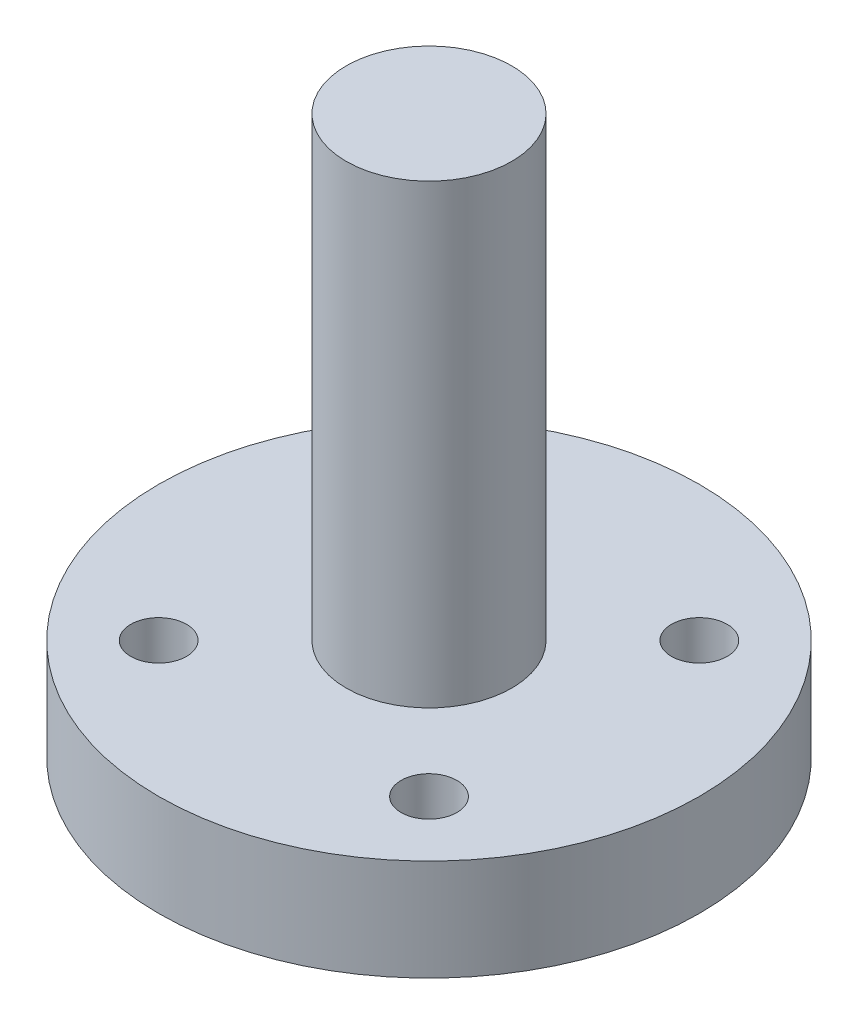
ISO-10303-21;
HEADER;
FILE_DESCRIPTION(('STEP AP214'),'2;1');
FILE_NAME('part.step','',(''),(''),'','','');
FILE_SCHEMA(('AUTOMOTIVE_DESIGN { 1 0 10303 214 1 1 1 1 }'));
ENDSEC;
DATA;
#1=APPLICATION_CONTEXT('core data for automotive mechanical design processes');
#2=APPLICATION_PROTOCOL_DEFINITION('international standard','automotive_design',2000,#1);
#3=PRODUCT_CONTEXT('',#1,'mechanical');
#4=PRODUCT('Part','Part','',(#3));
#5=PRODUCT_RELATED_PRODUCT_CATEGORY('part','',(#4));
#6=PRODUCT_DEFINITION_FORMATION('','',#4);
#7=PRODUCT_DEFINITION_CONTEXT('part definition',#1,'design');
#8=PRODUCT_DEFINITION('design','',#6,#7);
#9=PRODUCT_DEFINITION_SHAPE('','',#8);
#10=(LENGTH_UNIT() NAMED_UNIT(*) SI_UNIT(.MILLI.,.METRE.));
#11=(NAMED_UNIT(*) PLANE_ANGLE_UNIT() SI_UNIT($,.RADIAN.));
#12=(NAMED_UNIT(*) SI_UNIT($,.STERADIAN.) SOLID_ANGLE_UNIT());
#13=UNCERTAINTY_MEASURE_WITH_UNIT(LENGTH_MEASURE(1.E-05),#10,'distance_accuracy_value','');
#14=(GEOMETRIC_REPRESENTATION_CONTEXT(3) GLOBAL_UNCERTAINTY_ASSIGNED_CONTEXT((#13)) GLOBAL_UNIT_ASSIGNED_CONTEXT((#10,
#11,#12)) REPRESENTATION_CONTEXT('',''));
#15=CARTESIAN_POINT('',(0.,0.,0.));
#16=DIRECTION('',(0.,0.,1.));
#17=DIRECTION('',(1.,0.,0.));
#18=AXIS2_PLACEMENT_3D('',#15,#16,#17);
#19=CARTESIAN_POINT('',(0.,6.,0.));
#20=DIRECTION('',(0.,-1.,0.));
#21=DIRECTION('',(0.,0.,-1.));
#22=AXIS2_PLACEMENT_3D('',#19,#20,#21);
#23=CYLINDRICAL_SURFACE('',#22,16.);
#24=CARTESIAN_POINT('',(0.,6.,0.));
#25=DIRECTION('',(0.,1.,0.));
#26=DIRECTION('',(0.,0.,1.));
#27=AXIS2_PLACEMENT_3D('',#24,#25,#26);
#28=CIRCLE('',#27,16.);
#29=CARTESIAN_POINT('',(0.,6.,16.));
#30=VERTEX_POINT('',#29);
#31=EDGE_CURVE('E42',#30,#30,#28,.T.);
#32=ORIENTED_EDGE('',*,*,#31,.F.);
#33=EDGE_LOOP('',(#32));
#34=FACE_BOUND('',#33,.T.);
#35=CARTESIAN_POINT('',(0.,0.,0.));
#36=DIRECTION('',(0.,1.,0.));
#37=DIRECTION('',(0.,0.,1.));
#38=AXIS2_PLACEMENT_3D('',#35,#36,#37);
#39=CIRCLE('',#38,16.);
#40=CARTESIAN_POINT('',(0.,0.,16.));
#41=VERTEX_POINT('',#40);
#42=EDGE_CURVE('E38',#41,#41,#39,.T.);
#43=ORIENTED_EDGE('',*,*,#42,.T.);
#44=EDGE_LOOP('',(#43));
#45=FACE_BOUND('',#44,.T.);
#46=ADVANCED_FACE('F35',(#34,#45),#23,.T.);
#47=CARTESIAN_POINT('',(0.,6.,0.));
#48=DIRECTION('',(0.,1.,0.));
#49=DIRECTION('',(0.,0.,1.));
#50=AXIS2_PLACEMENT_3D('',#47,#48,#49);
#51=PLANE('',#50);
#52=CARTESIAN_POINT('',(0.,6.,0.));
#53=DIRECTION('',(0.,1.,0.));
#54=DIRECTION('',(0.,0.,1.));
#55=AXIS2_PLACEMENT_3D('',#52,#53,#54);
#56=CIRCLE('',#55,4.9);
#57=CARTESIAN_POINT('',(0.,6.,4.9));
#58=VERTEX_POINT('',#57);
#59=EDGE_CURVE('E10',#58,#58,#56,.T.);
#60=ORIENTED_EDGE('',*,*,#59,.F.);
#61=EDGE_LOOP('',(#60));
#62=FACE_BOUND('',#61,.T.);
#63=CARTESIAN_POINT('',(8.,6.,-8.));
#64=DIRECTION('',(0.,-1.,0.));
#65=DIRECTION('',(0.,0.,-1.));
#66=AXIS2_PLACEMENT_3D('',#63,#64,#65);
#67=CIRCLE('',#66,1.65);
#68=CARTESIAN_POINT('',(8.,6.,-9.65));
#69=VERTEX_POINT('',#68);
#70=EDGE_CURVE('E53',#69,#69,#67,.T.);
#71=ORIENTED_EDGE('',*,*,#70,.T.);
#72=EDGE_LOOP('',(#71));
#73=FACE_BOUND('',#72,.T.);
#74=CARTESIAN_POINT('',(7.99999999999999,6.,8.));
#75=DIRECTION('',(0.,-1.,0.));
#76=DIRECTION('',(0.,0.,-1.));
#77=AXIS2_PLACEMENT_3D('',#74,#75,#76);
#78=CIRCLE('',#77,1.65);
#79=CARTESIAN_POINT('',(7.99999999999999,6.,6.35));
#80=VERTEX_POINT('',#79);
#81=EDGE_CURVE('E59',#80,#80,#78,.T.);
#82=ORIENTED_EDGE('',*,*,#81,.T.);
#83=EDGE_LOOP('',(#82));
#84=FACE_BOUND('',#83,.T.);
#85=CARTESIAN_POINT('',(-8.,6.,8.));
#86=DIRECTION('',(0.,-1.,0.));
#87=DIRECTION('',(0.,0.,-1.));
#88=AXIS2_PLACEMENT_3D('',#85,#86,#87);
#89=CIRCLE('',#88,1.65);
#90=CARTESIAN_POINT('',(-8.,6.,6.35));
#91=VERTEX_POINT('',#90);
#92=EDGE_CURVE('E65',#91,#91,#89,.T.);
#93=ORIENTED_EDGE('',*,*,#92,.T.);
#94=EDGE_LOOP('',(#93));
#95=FACE_BOUND('',#94,.T.);
#96=CARTESIAN_POINT('',(-8.,6.,-8.));
#97=DIRECTION('',(0.,-1.,0.));
#98=DIRECTION('',(0.,0.,-1.));
#99=AXIS2_PLACEMENT_3D('',#96,#97,#98);
#100=CIRCLE('',#99,1.65);
#101=CARTESIAN_POINT('',(-8.,6.,-9.65));
#102=VERTEX_POINT('',#101);
#103=EDGE_CURVE('E71',#102,#102,#100,.T.);
#104=ORIENTED_EDGE('',*,*,#103,.T.);
#105=EDGE_LOOP('',(#104));
#106=FACE_BOUND('',#105,.T.);
#107=ORIENTED_EDGE('',*,*,#31,.T.);
#108=EDGE_LOOP('',(#107));
#109=FACE_BOUND('',#108,.T.);
#110=ADVANCED_FACE('F82',(#62,#73,#84,#95,#106,#109),#51,.T.);
#111=CARTESIAN_POINT('',(0.,0.,0.));
#112=DIRECTION('',(0.,1.,0.));
#113=DIRECTION('',(0.,0.,1.));
#114=AXIS2_PLACEMENT_3D('',#111,#112,#113);
#115=PLANE('',#114);
#116=CARTESIAN_POINT('',(8.,0.,-8.));
#117=DIRECTION('',(0.,-1.,0.));
#118=DIRECTION('',(0.,0.,-1.));
#119=AXIS2_PLACEMENT_3D('',#116,#117,#118);
#120=CIRCLE('',#119,1.64999999999999);
#121=CARTESIAN_POINT('',(8.,0.,-9.64999999999999));
#122=VERTEX_POINT('',#121);
#123=EDGE_CURVE('E50',#122,#122,#120,.T.);
#124=ORIENTED_EDGE('',*,*,#123,.F.);
#125=EDGE_LOOP('',(#124));
#126=FACE_BOUND('',#125,.T.);
#127=CARTESIAN_POINT('',(7.99999999999999,0.,8.));
#128=DIRECTION('',(0.,-1.,0.));
#129=DIRECTION('',(0.,0.,-1.));
#130=AXIS2_PLACEMENT_3D('',#127,#128,#129);
#131=CIRCLE('',#130,1.64999999999999);
#132=CARTESIAN_POINT('',(7.99999999999999,0.,6.35000000000001));
#133=VERTEX_POINT('',#132);
#134=EDGE_CURVE('E56',#133,#133,#131,.T.);
#135=ORIENTED_EDGE('',*,*,#134,.F.);
#136=EDGE_LOOP('',(#135));
#137=FACE_BOUND('',#136,.T.);
#138=CARTESIAN_POINT('',(-8.,0.,8.));
#139=DIRECTION('',(0.,-1.,0.));
#140=DIRECTION('',(0.,0.,-1.));
#141=AXIS2_PLACEMENT_3D('',#138,#139,#140);
#142=CIRCLE('',#141,1.64999999999999);
#143=CARTESIAN_POINT('',(-8.,0.,6.35000000000001));
#144=VERTEX_POINT('',#143);
#145=EDGE_CURVE('E62',#144,#144,#142,.T.);
#146=ORIENTED_EDGE('',*,*,#145,.F.);
#147=EDGE_LOOP('',(#146));
#148=FACE_BOUND('',#147,.T.);
#149=CARTESIAN_POINT('',(-8.,0.,-8.));
#150=DIRECTION('',(0.,-1.,0.));
#151=DIRECTION('',(0.,0.,-1.));
#152=AXIS2_PLACEMENT_3D('',#149,#150,#151);
#153=CIRCLE('',#152,1.64999999999999);
#154=CARTESIAN_POINT('',(-8.,0.,-9.64999999999999));
#155=VERTEX_POINT('',#154);
#156=EDGE_CURVE('E68',#155,#155,#153,.T.);
#157=ORIENTED_EDGE('',*,*,#156,.F.);
#158=EDGE_LOOP('',(#157));
#159=FACE_BOUND('',#158,.T.);
#160=ORIENTED_EDGE('',*,*,#42,.F.);
#161=EDGE_LOOP('',(#160));
#162=FACE_BOUND('',#161,.T.);
#163=ADVANCED_FACE('F79',(#126,#137,#148,#159,#162),#115,.F.);
#164=CARTESIAN_POINT('',(-8.,0.,-8.));
#165=DIRECTION('',(0.,-1.,0.));
#166=DIRECTION('',(0.,0.,-1.));
#167=AXIS2_PLACEMENT_3D('',#164,#165,#166);
#168=CYLINDRICAL_SURFACE('',#167,1.64999999999999);
#169=ORIENTED_EDGE('',*,*,#103,.F.);
#170=EDGE_LOOP('',(#169));
#171=FACE_BOUND('',#170,.T.);
#172=ORIENTED_EDGE('',*,*,#156,.T.);
#173=EDGE_LOOP('',(#172));
#174=FACE_BOUND('',#173,.T.);
#175=ADVANCED_FACE('F81',(#171,#174),#168,.F.);
#176=CARTESIAN_POINT('',(-8.,0.,8.));
#177=DIRECTION('',(0.,-1.,0.));
#178=DIRECTION('',(0.,0.,-1.));
#179=AXIS2_PLACEMENT_3D('',#176,#177,#178);
#180=CYLINDRICAL_SURFACE('',#179,1.64999999999999);
#181=ORIENTED_EDGE('',*,*,#92,.F.);
#182=EDGE_LOOP('',(#181));
#183=FACE_BOUND('',#182,.T.);
#184=ORIENTED_EDGE('',*,*,#145,.T.);
#185=EDGE_LOOP('',(#184));
#186=FACE_BOUND('',#185,.T.);
#187=ADVANCED_FACE('F88',(#183,#186),#180,.F.);
#188=CARTESIAN_POINT('',(7.99999999999999,0.,8.));
#189=DIRECTION('',(0.,-1.,0.));
#190=DIRECTION('',(0.,0.,-1.));
#191=AXIS2_PLACEMENT_3D('',#188,#189,#190);
#192=CYLINDRICAL_SURFACE('',#191,1.64999999999999);
#193=ORIENTED_EDGE('',*,*,#81,.F.);
#194=EDGE_LOOP('',(#193));
#195=FACE_BOUND('',#194,.T.);
#196=ORIENTED_EDGE('',*,*,#134,.T.);
#197=EDGE_LOOP('',(#196));
#198=FACE_BOUND('',#197,.T.);
#199=ADVANCED_FACE('F144',(#195,#198),#192,.F.);
#200=CARTESIAN_POINT('',(8.,0.,-8.));
#201=DIRECTION('',(0.,-1.,0.));
#202=DIRECTION('',(0.,0.,-1.));
#203=AXIS2_PLACEMENT_3D('',#200,#201,#202);
#204=CYLINDRICAL_SURFACE('',#203,1.64999999999999);
#205=ORIENTED_EDGE('',*,*,#70,.F.);
#206=EDGE_LOOP('',(#205));
#207=FACE_BOUND('',#206,.T.);
#208=ORIENTED_EDGE('',*,*,#123,.T.);
#209=EDGE_LOOP('',(#208));
#210=FACE_BOUND('',#209,.T.);
#211=ADVANCED_FACE('F113',(#207,#210),#204,.F.);
#212=CARTESIAN_POINT('',(0.,33.,0.));
#213=DIRECTION('',(0.,-1.,0.));
#214=DIRECTION('',(0.,0.,-1.));
#215=AXIS2_PLACEMENT_3D('',#212,#213,#214);
#216=CYLINDRICAL_SURFACE('',#215,4.9);
#217=CARTESIAN_POINT('',(0.,33.,0.));
#218=DIRECTION('',(0.,1.,0.));
#219=DIRECTION('',(0.,0.,1.));
#220=AXIS2_PLACEMENT_3D('',#217,#218,#219);
#221=CIRCLE('',#220,4.9);
#222=CARTESIAN_POINT('',(0.,33.,4.9));
#223=VERTEX_POINT('',#222);
#224=EDGE_CURVE('E49',#223,#223,#221,.T.);
#225=ORIENTED_EDGE('',*,*,#224,.F.);
#226=EDGE_LOOP('',(#225));
#227=FACE_BOUND('',#226,.T.);
#228=ORIENTED_EDGE('',*,*,#59,.T.);
#229=EDGE_LOOP('',(#228));
#230=FACE_BOUND('',#229,.T.);
#231=ADVANCED_FACE('F118',(#227,#230),#216,.T.);
#232=CARTESIAN_POINT('',(0.,33.,0.));
#233=DIRECTION('',(0.,1.,0.));
#234=DIRECTION('',(0.,0.,1.));
#235=AXIS2_PLACEMENT_3D('',#232,#233,#234);
#236=PLANE('',#235);
#237=ORIENTED_EDGE('',*,*,#224,.T.);
#238=EDGE_LOOP('',(#237));
#239=FACE_BOUND('',#238,.T.);
#240=ADVANCED_FACE('F123',(#239),#236,.T.);
#241=CLOSED_SHELL('',(#46,#110,#163,#175,#187,#199,#211,#231,#240));
#242=MANIFOLD_SOLID_BREP('B2',#241);
#243=ADVANCED_BREP_SHAPE_REPRESENTATION('',(#18,#242),#14);
#244=SHAPE_DEFINITION_REPRESENTATION(#9,#243);
ENDSEC;
END-ISO-10303-21;
